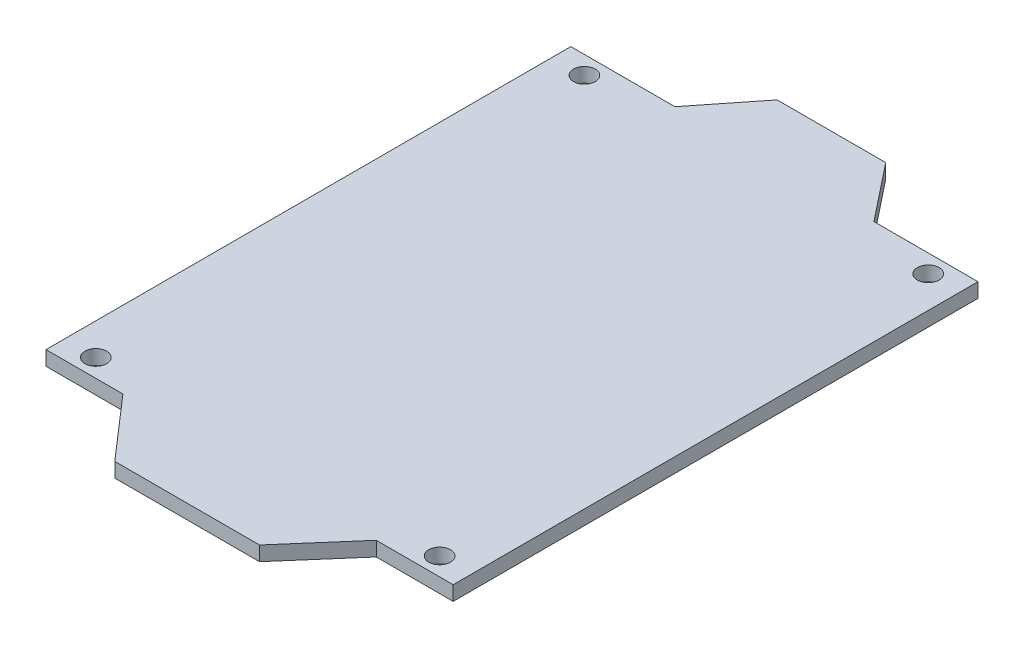
ISO-10303-21;
HEADER;
FILE_DESCRIPTION(('STEP AP214'),'2;1');
FILE_NAME('part.step','',(''),(''),'','','');
FILE_SCHEMA(('AUTOMOTIVE_DESIGN { 1 0 10303 214 1 1 1 1 }'));
ENDSEC;
DATA;
#1=APPLICATION_CONTEXT('core data for automotive mechanical design processes');
#2=APPLICATION_PROTOCOL_DEFINITION('international standard','automotive_design',2000,#1);
#3=PRODUCT_CONTEXT('',#1,'mechanical');
#4=PRODUCT('Part','Part','',(#3));
#5=PRODUCT_RELATED_PRODUCT_CATEGORY('part','',(#4));
#6=PRODUCT_DEFINITION_FORMATION('','',#4);
#7=PRODUCT_DEFINITION_CONTEXT('part definition',#1,'design');
#8=PRODUCT_DEFINITION('design','',#6,#7);
#9=PRODUCT_DEFINITION_SHAPE('','',#8);
#10=(LENGTH_UNIT() NAMED_UNIT(*) SI_UNIT(.MILLI.,.METRE.));
#11=(NAMED_UNIT(*) PLANE_ANGLE_UNIT() SI_UNIT($,.RADIAN.));
#12=(NAMED_UNIT(*) SI_UNIT($,.STERADIAN.) SOLID_ANGLE_UNIT());
#13=UNCERTAINTY_MEASURE_WITH_UNIT(LENGTH_MEASURE(1.E-05),#10,'distance_accuracy_value','');
#14=(GEOMETRIC_REPRESENTATION_CONTEXT(3) GLOBAL_UNCERTAINTY_ASSIGNED_CONTEXT((#13)) GLOBAL_UNIT_ASSIGNED_CONTEXT((#10,
#11,#12)) REPRESENTATION_CONTEXT('',''));
#15=CARTESIAN_POINT('',(0.,0.,0.));
#16=DIRECTION('',(0.,0.,1.));
#17=DIRECTION('',(1.,0.,0.));
#18=AXIS2_PLACEMENT_3D('',#15,#16,#17);
#19=CARTESIAN_POINT('',(0.,0.,0.));
#20=DIRECTION('',(0.,-1.,0.));
#21=DIRECTION('',(0.,0.,-1.));
#22=AXIS2_PLACEMENT_3D('',#19,#20,#21);
#23=PLANE('',#22);
#24=DIRECTION('',(0.656178714924787,0.,0.754605522163505));
#25=VECTOR('',#24,1.);
#26=CARTESIAN_POINT('',(-14.,0.,29.));
#27=LINE('',#26,#25);
#28=CARTESIAN_POINT('',(-14.,0.,29.));
#29=VERTEX_POINT('',#28);
#30=CARTESIAN_POINT('',(-8.,0.,35.9));
#31=VERTEX_POINT('',#30);
#32=EDGE_CURVE('E50',#29,#31,#27,.T.);
#33=ORIENTED_EDGE('',*,*,#32,.F.);
#34=DIRECTION('',(-1.,0.,0.));
#35=VECTOR('',#34,1.);
#36=CARTESIAN_POINT('',(-22.5,0.,29.));
#37=LINE('',#36,#35);
#38=CARTESIAN_POINT('',(-22.5,0.,29.));
#39=VERTEX_POINT('',#38);
#40=EDGE_CURVE('E138',#29,#39,#37,.T.);
#41=ORIENTED_EDGE('',*,*,#40,.T.);
#42=DIRECTION('',(0.,0.,-1.));
#43=VECTOR('',#42,1.);
#44=CARTESIAN_POINT('',(-22.5,0.,-29.));
#45=LINE('',#44,#43);
#46=CARTESIAN_POINT('',(-22.5,0.,-29.));
#47=VERTEX_POINT('',#46);
#48=EDGE_CURVE('E168',#39,#47,#45,.T.);
#49=ORIENTED_EDGE('',*,*,#48,.T.);
#50=DIRECTION('',(1.,0.,0.));
#51=VECTOR('',#50,1.);
#52=CARTESIAN_POINT('',(-22.5,0.,-29.));
#53=LINE('',#52,#51);
#54=CARTESIAN_POINT('',(-11.,0.,-29.));
#55=VERTEX_POINT('',#54);
#56=EDGE_CURVE('E157',#47,#55,#53,.T.);
#57=ORIENTED_EDGE('',*,*,#56,.T.);
#58=DIRECTION('',(0.62165785956401,0.,-0.783288903050652));
#59=VECTOR('',#58,1.);
#60=CARTESIAN_POINT('',(-11.,0.,-29.));
#61=LINE('',#60,#59);
#62=CARTESIAN_POINT('',(-5.99999999999999,0.,-35.3));
#63=VERTEX_POINT('',#62);
#64=EDGE_CURVE('E236',#55,#63,#61,.T.);
#65=ORIENTED_EDGE('',*,*,#64,.T.);
#66=DIRECTION('',(-1.,0.,0.));
#67=VECTOR('',#66,1.);
#68=CARTESIAN_POINT('',(11.,0.,-35.3));
#69=LINE('',#68,#67);
#70=CARTESIAN_POINT('',(6.,0.,-35.3));
#71=VERTEX_POINT('',#70);
#72=EDGE_CURVE('E197',#71,#63,#69,.T.);
#73=ORIENTED_EDGE('',*,*,#72,.F.);
#74=DIRECTION('',(-0.62165785956401,0.,-0.783288903050652));
#75=VECTOR('',#74,1.);
#76=CARTESIAN_POINT('',(20.8701499458958,0.,-16.5636110681713));
#77=LINE('',#76,#75);
#78=CARTESIAN_POINT('',(11.,0.,-29.));
#79=VERTEX_POINT('',#78);
#80=EDGE_CURVE('E241',#79,#71,#77,.T.);
#81=ORIENTED_EDGE('',*,*,#80,.F.);
#82=CARTESIAN_POINT('',(22.5,0.,-29.));
#83=VERTEX_POINT('',#82);
#84=EDGE_CURVE('E161',#79,#83,#53,.T.);
#85=ORIENTED_EDGE('',*,*,#84,.T.);
#86=DIRECTION('',(0.,0.,1.));
#87=VECTOR('',#86,1.);
#88=CARTESIAN_POINT('',(22.5,0.,-29.));
#89=LINE('',#88,#87);
#90=CARTESIAN_POINT('',(22.5,0.,29.));
#91=VERTEX_POINT('',#90);
#92=EDGE_CURVE('E178',#83,#91,#89,.T.);
#93=ORIENTED_EDGE('',*,*,#92,.T.);
#94=CARTESIAN_POINT('',(14.,0.,29.));
#95=VERTEX_POINT('',#94);
#96=EDGE_CURVE('E172',#91,#95,#37,.T.);
#97=ORIENTED_EDGE('',*,*,#96,.T.);
#98=DIRECTION('',(-0.656178714924787,0.,0.754605522163505));
#99=VECTOR('',#98,1.);
#100=CARTESIAN_POINT('',(14.,0.,29.));
#101=LINE('',#100,#99);
#102=CARTESIAN_POINT('',(8.,0.,35.9));
#103=VERTEX_POINT('',#102);
#104=EDGE_CURVE('E254',#95,#103,#101,.T.);
#105=ORIENTED_EDGE('',*,*,#104,.T.);
#106=DIRECTION('',(1.,0.,0.));
#107=VECTOR('',#106,1.);
#108=CARTESIAN_POINT('',(-14.,0.,35.9));
#109=LINE('',#108,#107);
#110=EDGE_CURVE('E246',#31,#103,#109,.T.);
#111=ORIENTED_EDGE('',*,*,#110,.F.);
#112=EDGE_LOOP('',(#33,#41,#49,#57,#65,#73,#81,#85,#93,#97,#105,#111));
#113=FACE_BOUND('',#112,.T.);
#114=CARTESIAN_POINT('',(18.9999999999996,0.,26.9999999999999));
#115=DIRECTION('',(0.,-1.,0.));
#116=DIRECTION('',(0.,0.,-1.));
#117=AXIS2_PLACEMENT_3D('',#114,#115,#116);
#118=CIRCLE('',#117,1.20000000000002);
#119=CARTESIAN_POINT('',(18.9999999999996,0.,25.7999999999999));
#120=VERTEX_POINT('',#119);
#121=EDGE_CURVE('E189',#120,#120,#118,.F.);
#122=ORIENTED_EDGE('',*,*,#121,.T.);
#123=EDGE_LOOP('',(#122));
#124=FACE_BOUND('',#123,.T.);
#125=CARTESIAN_POINT('',(-19.0000000000003,0.,-27.0000000000001));
#126=DIRECTION('',(0.,-1.,0.));
#127=DIRECTION('',(0.,0.,-1.));
#128=AXIS2_PLACEMENT_3D('',#125,#126,#127);
#129=CIRCLE('',#128,1.19999999999999);
#130=CARTESIAN_POINT('',(-19.0000000000003,0.,-28.2));
#131=VERTEX_POINT('',#130);
#132=EDGE_CURVE('E160',#131,#131,#129,.F.);
#133=ORIENTED_EDGE('',*,*,#132,.T.);
#134=EDGE_LOOP('',(#133));
#135=FACE_BOUND('',#134,.T.);
#136=CARTESIAN_POINT('',(18.9999999999996,0.,-27.0000000000001));
#137=DIRECTION('',(0.,-1.,0.));
#138=DIRECTION('',(0.,0.,-1.));
#139=AXIS2_PLACEMENT_3D('',#136,#137,#138);
#140=CIRCLE('',#139,1.20000000000002);
#141=CARTESIAN_POINT('',(18.9999999999996,0.,-28.2000000000001));
#142=VERTEX_POINT('',#141);
#143=EDGE_CURVE('E179',#142,#142,#140,.F.);
#144=ORIENTED_EDGE('',*,*,#143,.T.);
#145=EDGE_LOOP('',(#144));
#146=FACE_BOUND('',#145,.T.);
#147=CARTESIAN_POINT('',(-19.0000000000003,0.,26.9999999999999));
#148=DIRECTION('',(0.,-1.,0.));
#149=DIRECTION('',(0.,0.,-1.));
#150=AXIS2_PLACEMENT_3D('',#147,#148,#149);
#151=CIRCLE('',#150,1.20000000000002);
#152=CARTESIAN_POINT('',(-19.0000000000003,0.,25.7999999999999));
#153=VERTEX_POINT('',#152);
#154=EDGE_CURVE('E37',#153,#153,#151,.F.);
#155=ORIENTED_EDGE('',*,*,#154,.T.);
#156=EDGE_LOOP('',(#155));
#157=FACE_BOUND('',#156,.T.);
#158=ADVANCED_FACE('F34',(#113,#124,#135,#146,#157),#23,.T.);
#159=CARTESIAN_POINT('',(0.,1.6,0.));
#160=DIRECTION('',(0.,-1.,0.));
#161=DIRECTION('',(0.,0.,-1.));
#162=AXIS2_PLACEMENT_3D('',#159,#160,#161);
#163=PLANE('',#162);
#164=CARTESIAN_POINT('',(18.9999999999996,1.6,26.9999999999999));
#165=DIRECTION('',(0.,-1.,0.));
#166=DIRECTION('',(0.,0.,-1.));
#167=AXIS2_PLACEMENT_3D('',#164,#165,#166);
#168=CIRCLE('',#167,1.20000000000002);
#169=CARTESIAN_POINT('',(18.9999999999996,1.6,25.7999999999999));
#170=VERTEX_POINT('',#169);
#171=EDGE_CURVE('E11',#170,#170,#168,.F.);
#172=ORIENTED_EDGE('',*,*,#171,.F.);
#173=EDGE_LOOP('',(#172));
#174=FACE_BOUND('',#173,.T.);
#175=CARTESIAN_POINT('',(-19.0000000000003,1.6,-27.0000000000001));
#176=DIRECTION('',(0.,-1.,0.));
#177=DIRECTION('',(0.,0.,-1.));
#178=AXIS2_PLACEMENT_3D('',#175,#176,#177);
#179=CIRCLE('',#178,1.19999999999999);
#180=CARTESIAN_POINT('',(-19.0000000000003,1.6,-28.2));
#181=VERTEX_POINT('',#180);
#182=EDGE_CURVE('E42',#181,#181,#179,.F.);
#183=ORIENTED_EDGE('',*,*,#182,.F.);
#184=EDGE_LOOP('',(#183));
#185=FACE_BOUND('',#184,.T.);
#186=CARTESIAN_POINT('',(18.9999999999996,1.6,-27.0000000000001));
#187=DIRECTION('',(0.,-1.,0.));
#188=DIRECTION('',(0.,0.,-1.));
#189=AXIS2_PLACEMENT_3D('',#186,#187,#188);
#190=CIRCLE('',#189,1.20000000000002);
#191=CARTESIAN_POINT('',(18.9999999999996,1.6,-28.2000000000001));
#192=VERTEX_POINT('',#191);
#193=EDGE_CURVE('E152',#192,#192,#190,.F.);
#194=ORIENTED_EDGE('',*,*,#193,.F.);
#195=EDGE_LOOP('',(#194));
#196=FACE_BOUND('',#195,.T.);
#197=CARTESIAN_POINT('',(-19.0000000000003,1.6,26.9999999999999));
#198=DIRECTION('',(0.,-1.,0.));
#199=DIRECTION('',(0.,0.,-1.));
#200=AXIS2_PLACEMENT_3D('',#197,#198,#199);
#201=CIRCLE('',#200,1.20000000000002);
#202=CARTESIAN_POINT('',(-19.0000000000003,1.6,25.7999999999999));
#203=VERTEX_POINT('',#202);
#204=EDGE_CURVE('E186',#203,#203,#201,.F.);
#205=ORIENTED_EDGE('',*,*,#204,.F.);
#206=EDGE_LOOP('',(#205));
#207=FACE_BOUND('',#206,.T.);
#208=DIRECTION('',(1.,0.,0.));
#209=VECTOR('',#208,1.);
#210=CARTESIAN_POINT('',(0.,1.6,29.));
#211=LINE('',#210,#209);
#212=CARTESIAN_POINT('',(-14.,1.6,29.));
#213=VERTEX_POINT('',#212);
#214=CARTESIAN_POINT('',(-22.5,1.6,29.));
#215=VERTEX_POINT('',#214);
#216=EDGE_CURVE('E136',#213,#215,#211,.F.);
#217=ORIENTED_EDGE('',*,*,#216,.F.);
#218=DIRECTION('',(0.656178714924787,0.,0.754605522163505));
#219=VECTOR('',#218,1.);
#220=CARTESIAN_POINT('',(-14.,1.6,29.));
#221=LINE('',#220,#219);
#222=CARTESIAN_POINT('',(-8.,1.6,35.9));
#223=VERTEX_POINT('',#222);
#224=EDGE_CURVE('E122',#213,#223,#221,.T.);
#225=ORIENTED_EDGE('',*,*,#224,.T.);
#226=DIRECTION('',(-1.,0.,0.));
#227=VECTOR('',#226,1.);
#228=CARTESIAN_POINT('',(-14.,1.6,35.9));
#229=LINE('',#228,#227);
#230=CARTESIAN_POINT('',(8.,1.6,35.9));
#231=VERTEX_POINT('',#230);
#232=EDGE_CURVE('E139',#231,#223,#229,.T.);
#233=ORIENTED_EDGE('',*,*,#232,.F.);
#234=DIRECTION('',(-0.656178714924787,0.,0.754605522163505));
#235=VECTOR('',#234,1.);
#236=CARTESIAN_POINT('',(14.,1.6,29.));
#237=LINE('',#236,#235);
#238=CARTESIAN_POINT('',(14.,1.6,29.));
#239=VERTEX_POINT('',#238);
#240=EDGE_CURVE('E58',#239,#231,#237,.T.);
#241=ORIENTED_EDGE('',*,*,#240,.F.);
#242=CARTESIAN_POINT('',(22.5,1.6,29.));
#243=VERTEX_POINT('',#242);
#244=EDGE_CURVE('E147',#243,#239,#211,.F.);
#245=ORIENTED_EDGE('',*,*,#244,.F.);
#246=DIRECTION('',(0.,0.,-1.));
#247=VECTOR('',#246,1.);
#248=CARTESIAN_POINT('',(22.5,1.6,0.));
#249=LINE('',#248,#247);
#250=CARTESIAN_POINT('',(22.5,1.6,-29.));
#251=VERTEX_POINT('',#250);
#252=EDGE_CURVE('E148',#251,#243,#249,.F.);
#253=ORIENTED_EDGE('',*,*,#252,.F.);
#254=DIRECTION('',(1.,0.,0.));
#255=VECTOR('',#254,1.);
#256=CARTESIAN_POINT('',(0.,1.6,-29.));
#257=LINE('',#256,#255);
#258=CARTESIAN_POINT('',(11.,1.6,-29.));
#259=VERTEX_POINT('',#258);
#260=EDGE_CURVE('E216',#259,#251,#257,.T.);
#261=ORIENTED_EDGE('',*,*,#260,.F.);
#262=DIRECTION('',(-0.62165785956401,0.,-0.783288903050652));
#263=VECTOR('',#262,1.);
#264=CARTESIAN_POINT('',(20.8701499458958,1.6,-16.5636110681713));
#265=LINE('',#264,#263);
#266=CARTESIAN_POINT('',(6.,1.6,-35.3));
#267=VERTEX_POINT('',#266);
#268=EDGE_CURVE('E239',#259,#267,#265,.T.);
#269=ORIENTED_EDGE('',*,*,#268,.T.);
#270=DIRECTION('',(1.,0.,0.));
#271=VECTOR('',#270,1.);
#272=CARTESIAN_POINT('',(11.,1.6,-35.3));
#273=LINE('',#272,#271);
#274=CARTESIAN_POINT('',(-5.99999999999999,1.6,-35.3));
#275=VERTEX_POINT('',#274);
#276=EDGE_CURVE('E201',#275,#267,#273,.T.);
#277=ORIENTED_EDGE('',*,*,#276,.F.);
#278=DIRECTION('',(0.62165785956401,0.,-0.783288903050652));
#279=VECTOR('',#278,1.);
#280=CARTESIAN_POINT('',(-11.,1.6,-29.));
#281=LINE('',#280,#279);
#282=CARTESIAN_POINT('',(-11.,1.6,-29.));
#283=VERTEX_POINT('',#282);
#284=EDGE_CURVE('E235',#283,#275,#281,.T.);
#285=ORIENTED_EDGE('',*,*,#284,.F.);
#286=CARTESIAN_POINT('',(-22.5,1.6,-29.));
#287=VERTEX_POINT('',#286);
#288=EDGE_CURVE('E183',#287,#283,#257,.T.);
#289=ORIENTED_EDGE('',*,*,#288,.F.);
#290=DIRECTION('',(0.,0.,-1.));
#291=VECTOR('',#290,1.);
#292=CARTESIAN_POINT('',(-22.5,1.6,0.));
#293=LINE('',#292,#291);
#294=EDGE_CURVE('E146',#215,#287,#293,.T.);
#295=ORIENTED_EDGE('',*,*,#294,.F.);
#296=EDGE_LOOP('',(#217,#225,#233,#241,#245,#253,#261,#269,#277,#285,#289,#295));
#297=FACE_BOUND('',#296,.T.);
#298=ADVANCED_FACE('F143',(#174,#185,#196,#207,#297),#163,.F.);
#299=CARTESIAN_POINT('',(0.,0.,35.9));
#300=DIRECTION('',(0.,0.,1.));
#301=DIRECTION('',(1.,0.,0.));
#302=AXIS2_PLACEMENT_3D('',#299,#300,#301);
#303=PLANE('',#302);
#304=DIRECTION('',(0.,-1.,0.));
#305=VECTOR('',#304,1.);
#306=CARTESIAN_POINT('',(-8.,1.6,35.9));
#307=LINE('',#306,#305);
#308=EDGE_CURVE('E126',#223,#31,#307,.T.);
#309=ORIENTED_EDGE('',*,*,#308,.T.);
#310=ORIENTED_EDGE('',*,*,#110,.T.);
#311=DIRECTION('',(0.,-1.,0.));
#312=VECTOR('',#311,1.);
#313=CARTESIAN_POINT('',(8.,1.6,35.9));
#314=LINE('',#313,#312);
#315=EDGE_CURVE('E255',#231,#103,#314,.T.);
#316=ORIENTED_EDGE('',*,*,#315,.F.);
#317=ORIENTED_EDGE('',*,*,#232,.T.);
#318=EDGE_LOOP('',(#309,#310,#316,#317));
#319=FACE_BOUND('',#318,.T.);
#320=ADVANCED_FACE('F262',(#319),#303,.T.);
#321=CARTESIAN_POINT('',(-22.5,1.6,29.));
#322=DIRECTION('',(0.,0.,-1.));
#323=DIRECTION('',(-1.,0.,0.));
#324=AXIS2_PLACEMENT_3D('',#321,#322,#323);
#325=PLANE('',#324);
#326=DIRECTION('',(0.,1.,0.));
#327=VECTOR('',#326,1.);
#328=CARTESIAN_POINT('',(14.,1.6,29.));
#329=LINE('',#328,#327);
#330=EDGE_CURVE('E140',#95,#239,#329,.T.);
#331=ORIENTED_EDGE('',*,*,#330,.F.);
#332=ORIENTED_EDGE('',*,*,#96,.F.);
#333=DIRECTION('',(0.,1.,0.));
#334=VECTOR('',#333,1.);
#335=CARTESIAN_POINT('',(22.5,1.6,29.));
#336=LINE('',#335,#334);
#337=EDGE_CURVE('E175',#243,#91,#336,.F.);
#338=ORIENTED_EDGE('',*,*,#337,.F.);
#339=ORIENTED_EDGE('',*,*,#244,.T.);
#340=EDGE_LOOP('',(#331,#332,#338,#339));
#341=FACE_BOUND('',#340,.T.);
#342=ADVANCED_FACE('F267',(#341),#325,.F.);
#343=DIRECTION('',(0.,-1.,0.));
#344=VECTOR('',#343,1.);
#345=CARTESIAN_POINT('',(-14.,1.6,29.));
#346=LINE('',#345,#344);
#347=EDGE_CURVE('E125',#213,#29,#346,.T.);
#348=ORIENTED_EDGE('',*,*,#347,.F.);
#349=ORIENTED_EDGE('',*,*,#216,.T.);
#350=DIRECTION('',(0.,1.,0.));
#351=VECTOR('',#350,1.);
#352=CARTESIAN_POINT('',(-22.5,1.6,29.));
#353=LINE('',#352,#351);
#354=EDGE_CURVE('E170',#215,#39,#353,.F.);
#355=ORIENTED_EDGE('',*,*,#354,.T.);
#356=ORIENTED_EDGE('',*,*,#40,.F.);
#357=EDGE_LOOP('',(#348,#349,#355,#356));
#358=FACE_BOUND('',#357,.T.);
#359=ADVANCED_FACE('F134',(#358),#325,.F.);
#360=CARTESIAN_POINT('',(0.,0.,-35.3));
#361=DIRECTION('',(0.,0.,-1.));
#362=DIRECTION('',(-1.,0.,0.));
#363=AXIS2_PLACEMENT_3D('',#360,#361,#362);
#364=PLANE('',#363);
#365=ORIENTED_EDGE('',*,*,#276,.T.);
#366=DIRECTION('',(0.,1.,0.));
#367=VECTOR('',#366,1.);
#368=CARTESIAN_POINT('',(6.,0.,-35.3));
#369=LINE('',#368,#367);
#370=EDGE_CURVE('E214',#71,#267,#369,.T.);
#371=ORIENTED_EDGE('',*,*,#370,.F.);
#372=ORIENTED_EDGE('',*,*,#72,.T.);
#373=DIRECTION('',(0.,1.,0.));
#374=VECTOR('',#373,1.);
#375=CARTESIAN_POINT('',(-5.99999999999999,0.,-35.3));
#376=LINE('',#375,#374);
#377=EDGE_CURVE('E243',#63,#275,#376,.T.);
#378=ORIENTED_EDGE('',*,*,#377,.T.);
#379=EDGE_LOOP('',(#365,#371,#372,#378));
#380=FACE_BOUND('',#379,.T.);
#381=ADVANCED_FACE('F277',(#380),#364,.T.);
#382=CARTESIAN_POINT('',(-22.5,1.6,-29.));
#383=DIRECTION('',(0.,0.,1.));
#384=DIRECTION('',(1.,0.,0.));
#385=AXIS2_PLACEMENT_3D('',#382,#383,#384);
#386=PLANE('',#385);
#387=DIRECTION('',(0.,1.,0.));
#388=VECTOR('',#387,1.);
#389=CARTESIAN_POINT('',(-11.,1.6,-29.));
#390=LINE('',#389,#388);
#391=EDGE_CURVE('E212',#55,#283,#390,.T.);
#392=ORIENTED_EDGE('',*,*,#391,.F.);
#393=ORIENTED_EDGE('',*,*,#56,.F.);
#394=DIRECTION('',(0.,1.,0.));
#395=VECTOR('',#394,1.);
#396=CARTESIAN_POINT('',(-22.5,1.6,-29.));
#397=LINE('',#396,#395);
#398=EDGE_CURVE('E162',#287,#47,#397,.F.);
#399=ORIENTED_EDGE('',*,*,#398,.F.);
#400=ORIENTED_EDGE('',*,*,#288,.T.);
#401=EDGE_LOOP('',(#392,#393,#399,#400));
#402=FACE_BOUND('',#401,.T.);
#403=ADVANCED_FACE('F231',(#402),#386,.F.);
#404=DIRECTION('',(0.,-1.,0.));
#405=VECTOR('',#404,1.);
#406=CARTESIAN_POINT('',(11.,1.6,-29.));
#407=LINE('',#406,#405);
#408=EDGE_CURVE('E208',#259,#79,#407,.T.);
#409=ORIENTED_EDGE('',*,*,#408,.F.);
#410=ORIENTED_EDGE('',*,*,#260,.T.);
#411=DIRECTION('',(0.,1.,0.));
#412=VECTOR('',#411,1.);
#413=CARTESIAN_POINT('',(22.5,1.6,-29.));
#414=LINE('',#413,#412);
#415=EDGE_CURVE('E165',#83,#251,#414,.T.);
#416=ORIENTED_EDGE('',*,*,#415,.F.);
#417=ORIENTED_EDGE('',*,*,#84,.F.);
#418=EDGE_LOOP('',(#409,#410,#416,#417));
#419=FACE_BOUND('',#418,.T.);
#420=ADVANCED_FACE('F273',(#419),#386,.F.);
#421=CARTESIAN_POINT('',(-19.0000000000003,1.6,26.9999999999999));
#422=DIRECTION('',(0.,-1.,0.));
#423=DIRECTION('',(0.,0.,-1.));
#424=AXIS2_PLACEMENT_3D('',#421,#422,#423);
#425=CYLINDRICAL_SURFACE('',#424,1.20000000000002);
#426=ORIENTED_EDGE('',*,*,#154,.F.);
#427=EDGE_LOOP('',(#426));
#428=FACE_BOUND('',#427,.T.);
#429=ORIENTED_EDGE('',*,*,#204,.T.);
#430=EDGE_LOOP('',(#429));
#431=FACE_BOUND('',#430,.T.);
#432=ADVANCED_FACE('F315',(#428,#431),#425,.F.);
#433=CARTESIAN_POINT('',(18.9999999999996,1.6,-27.0000000000001));
#434=DIRECTION('',(0.,-1.,0.));
#435=DIRECTION('',(0.,0.,-1.));
#436=AXIS2_PLACEMENT_3D('',#433,#434,#435);
#437=CYLINDRICAL_SURFACE('',#436,1.20000000000002);
#438=ORIENTED_EDGE('',*,*,#143,.F.);
#439=EDGE_LOOP('',(#438));
#440=FACE_BOUND('',#439,.T.);
#441=ORIENTED_EDGE('',*,*,#193,.T.);
#442=EDGE_LOOP('',(#441));
#443=FACE_BOUND('',#442,.T.);
#444=ADVANCED_FACE('F313',(#440,#443),#437,.F.);
#445=CARTESIAN_POINT('',(22.5,1.6,-29.));
#446=DIRECTION('',(-1.,0.,0.));
#447=DIRECTION('',(0.,0.,1.));
#448=AXIS2_PLACEMENT_3D('',#445,#446,#447);
#449=PLANE('',#448);
#450=ORIENTED_EDGE('',*,*,#415,.T.);
#451=ORIENTED_EDGE('',*,*,#252,.T.);
#452=ORIENTED_EDGE('',*,*,#337,.T.);
#453=ORIENTED_EDGE('',*,*,#92,.F.);
#454=EDGE_LOOP('',(#450,#451,#452,#453));
#455=FACE_BOUND('',#454,.T.);
#456=ADVANCED_FACE('F270',(#455),#449,.F.);
#457=CARTESIAN_POINT('',(-22.5,1.6,-29.));
#458=DIRECTION('',(1.,0.,0.));
#459=DIRECTION('',(0.,0.,-1.));
#460=AXIS2_PLACEMENT_3D('',#457,#458,#459);
#461=PLANE('',#460);
#462=ORIENTED_EDGE('',*,*,#354,.F.);
#463=ORIENTED_EDGE('',*,*,#294,.T.);
#464=ORIENTED_EDGE('',*,*,#398,.T.);
#465=ORIENTED_EDGE('',*,*,#48,.F.);
#466=EDGE_LOOP('',(#462,#463,#464,#465));
#467=FACE_BOUND('',#466,.T.);
#468=ADVANCED_FACE('F225',(#467),#461,.F.);
#469=CARTESIAN_POINT('',(-19.0000000000003,1.6,-27.0000000000001));
#470=DIRECTION('',(0.,-1.,0.));
#471=DIRECTION('',(0.,0.,-1.));
#472=AXIS2_PLACEMENT_3D('',#469,#470,#471);
#473=CYLINDRICAL_SURFACE('',#472,1.19999999999999);
#474=ORIENTED_EDGE('',*,*,#132,.F.);
#475=EDGE_LOOP('',(#474));
#476=FACE_BOUND('',#475,.T.);
#477=ORIENTED_EDGE('',*,*,#182,.T.);
#478=EDGE_LOOP('',(#477));
#479=FACE_BOUND('',#478,.T.);
#480=ADVANCED_FACE('F303',(#476,#479),#473,.F.);
#481=CARTESIAN_POINT('',(18.9999999999996,1.6,26.9999999999999));
#482=DIRECTION('',(0.,-1.,0.));
#483=DIRECTION('',(0.,0.,-1.));
#484=AXIS2_PLACEMENT_3D('',#481,#482,#483);
#485=CYLINDRICAL_SURFACE('',#484,1.20000000000002);
#486=ORIENTED_EDGE('',*,*,#121,.F.);
#487=EDGE_LOOP('',(#486));
#488=FACE_BOUND('',#487,.T.);
#489=ORIENTED_EDGE('',*,*,#171,.T.);
#490=EDGE_LOOP('',(#489));
#491=FACE_BOUND('',#490,.T.);
#492=ADVANCED_FACE('F300',(#488,#491),#485,.F.);
#493=CARTESIAN_POINT('',(-11.,0.,-29.));
#494=DIRECTION('',(0.783288903050652,0.,0.62165785956401));
#495=DIRECTION('',(0.62165785956401,0.,-0.783288903050652));
#496=AXIS2_PLACEMENT_3D('',#493,#494,#495);
#497=PLANE('',#496);
#498=ORIENTED_EDGE('',*,*,#284,.T.);
#499=ORIENTED_EDGE('',*,*,#377,.F.);
#500=ORIENTED_EDGE('',*,*,#64,.F.);
#501=ORIENTED_EDGE('',*,*,#391,.T.);
#502=EDGE_LOOP('',(#498,#499,#500,#501));
#503=FACE_BOUND('',#502,.T.);
#504=ADVANCED_FACE('F234',(#503),#497,.F.);
#505=CARTESIAN_POINT('',(20.8701499458958,0.,-16.5636110681713));
#506=DIRECTION('',(0.783288903050652,0.,-0.62165785956401));
#507=DIRECTION('',(-0.62165785956401,0.,-0.783288903050652));
#508=AXIS2_PLACEMENT_3D('',#505,#506,#507);
#509=PLANE('',#508);
#510=ORIENTED_EDGE('',*,*,#268,.F.);
#511=ORIENTED_EDGE('',*,*,#408,.T.);
#512=ORIENTED_EDGE('',*,*,#80,.T.);
#513=ORIENTED_EDGE('',*,*,#370,.T.);
#514=EDGE_LOOP('',(#510,#511,#512,#513));
#515=FACE_BOUND('',#514,.T.);
#516=ADVANCED_FACE('F276',(#515),#509,.T.);
#517=CARTESIAN_POINT('',(14.,1.6,29.));
#518=DIRECTION('',(0.754605522163505,0.,0.656178714924787));
#519=DIRECTION('',(0.656178714924787,0.,-0.754605522163505));
#520=AXIS2_PLACEMENT_3D('',#517,#518,#519);
#521=PLANE('',#520);
#522=ORIENTED_EDGE('',*,*,#104,.F.);
#523=ORIENTED_EDGE('',*,*,#330,.T.);
#524=ORIENTED_EDGE('',*,*,#240,.T.);
#525=ORIENTED_EDGE('',*,*,#315,.T.);
#526=EDGE_LOOP('',(#522,#523,#524,#525));
#527=FACE_BOUND('',#526,.T.);
#528=ADVANCED_FACE('F265',(#527),#521,.T.);
#529=CARTESIAN_POINT('',(-14.,1.6,29.));
#530=DIRECTION('',(0.754605522163505,0.,-0.656178714924787));
#531=DIRECTION('',(-0.656178714924787,0.,-0.754605522163505));
#532=AXIS2_PLACEMENT_3D('',#529,#530,#531);
#533=PLANE('',#532);
#534=ORIENTED_EDGE('',*,*,#32,.T.);
#535=ORIENTED_EDGE('',*,*,#308,.F.);
#536=ORIENTED_EDGE('',*,*,#224,.F.);
#537=ORIENTED_EDGE('',*,*,#347,.T.);
#538=EDGE_LOOP('',(#534,#535,#536,#537));
#539=FACE_BOUND('',#538,.T.);
#540=ADVANCED_FACE('F124',(#539),#533,.F.);
#541=CLOSED_SHELL('',(#158,#298,#320,#342,#359,#381,#403,#420,#432,#444,#456,#468,#480,#492,
#504,#516,#528,#540));
#542=MANIFOLD_SOLID_BREP('B2',#541);
#543=ADVANCED_BREP_SHAPE_REPRESENTATION('',(#18,#542),#14);
#544=SHAPE_DEFINITION_REPRESENTATION(#9,#543);
ENDSEC;
END-ISO-10303-21;
